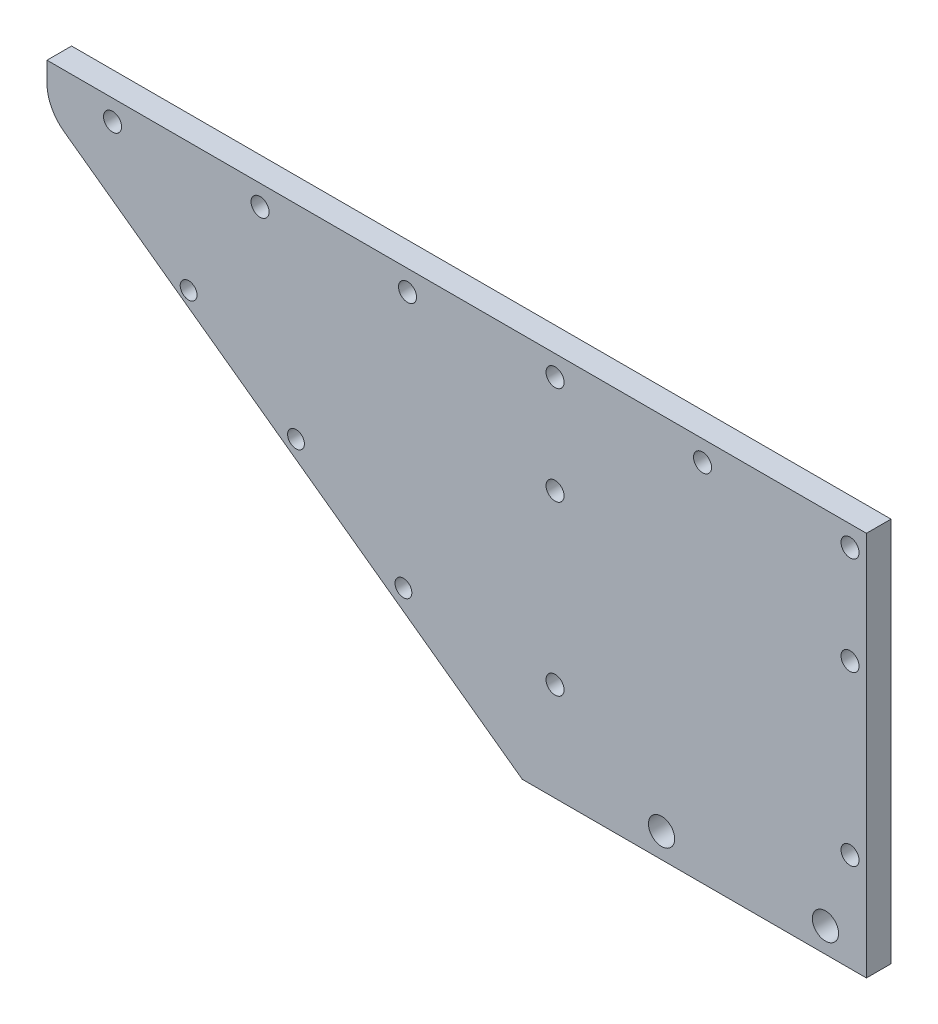
ISO-10303-21;
HEADER;
FILE_DESCRIPTION(('STEP AP214'),'2;1');
FILE_NAME('part.step','',(''),(''),'','','');
FILE_SCHEMA(('AUTOMOTIVE_DESIGN { 1 0 10303 214 1 1 1 1 }'));
ENDSEC;
DATA;
#1=APPLICATION_CONTEXT('core data for automotive mechanical design processes');
#2=APPLICATION_PROTOCOL_DEFINITION('international standard','automotive_design',2000,#1);
#3=PRODUCT_CONTEXT('',#1,'mechanical');
#4=PRODUCT('Part','Part','',(#3));
#5=PRODUCT_RELATED_PRODUCT_CATEGORY('part','',(#4));
#6=PRODUCT_DEFINITION_FORMATION('','',#4);
#7=PRODUCT_DEFINITION_CONTEXT('part definition',#1,'design');
#8=PRODUCT_DEFINITION('design','',#6,#7);
#9=PRODUCT_DEFINITION_SHAPE('','',#8);
#10=(LENGTH_UNIT() NAMED_UNIT(*) SI_UNIT(.MILLI.,.METRE.));
#11=(NAMED_UNIT(*) PLANE_ANGLE_UNIT() SI_UNIT($,.RADIAN.));
#12=(NAMED_UNIT(*) SI_UNIT($,.STERADIAN.) SOLID_ANGLE_UNIT());
#13=UNCERTAINTY_MEASURE_WITH_UNIT(LENGTH_MEASURE(1.E-05),#10,'distance_accuracy_value','');
#14=(GEOMETRIC_REPRESENTATION_CONTEXT(3) GLOBAL_UNCERTAINTY_ASSIGNED_CONTEXT((#13)) GLOBAL_UNIT_ASSIGNED_CONTEXT((#10,
#11,#12)) REPRESENTATION_CONTEXT('',''));
#15=CARTESIAN_POINT('',(0.,0.,0.));
#16=DIRECTION('',(0.,0.,1.));
#17=DIRECTION('',(1.,0.,0.));
#18=AXIS2_PLACEMENT_3D('',#15,#16,#17);
#19=CARTESIAN_POINT('',(-100.,0.,3.));
#20=DIRECTION('',(0.,-1.,0.));
#21=DIRECTION('',(0.,0.,-1.));
#22=AXIS2_PLACEMENT_3D('',#19,#20,#21);
#23=PLANE('',#22);
#24=DIRECTION('',(-1.,0.,0.));
#25=VECTOR('',#24,1.);
#26=CARTESIAN_POINT('',(-100.,0.,0.));
#27=LINE('',#26,#25);
#28=CARTESIAN_POINT('',(0.,0.,0.));
#29=VERTEX_POINT('',#28);
#30=CARTESIAN_POINT('',(-100.,0.,0.));
#31=VERTEX_POINT('',#30);
#32=EDGE_CURVE('E118',#29,#31,#27,.T.);
#33=ORIENTED_EDGE('',*,*,#32,.T.);
#34=DIRECTION('',(0.,0.,-1.));
#35=VECTOR('',#34,1.);
#36=CARTESIAN_POINT('',(-100.,0.,3.));
#37=LINE('',#36,#35);
#38=CARTESIAN_POINT('',(-100.,0.,3.));
#39=VERTEX_POINT('',#38);
#40=EDGE_CURVE('E99',#39,#31,#37,.T.);
#41=ORIENTED_EDGE('',*,*,#40,.F.);
#42=DIRECTION('',(-1.,0.,0.));
#43=VECTOR('',#42,1.);
#44=CARTESIAN_POINT('',(-100.,0.,3.));
#45=LINE('',#44,#43);
#46=CARTESIAN_POINT('',(0.,0.,3.));
#47=VERTEX_POINT('',#46);
#48=EDGE_CURVE('E105',#47,#39,#45,.T.);
#49=ORIENTED_EDGE('',*,*,#48,.F.);
#50=DIRECTION('',(0.,0.,-1.));
#51=VECTOR('',#50,1.);
#52=CARTESIAN_POINT('',(0.,0.,3.));
#53=LINE('',#52,#51);
#54=EDGE_CURVE('E137',#47,#29,#53,.T.);
#55=ORIENTED_EDGE('',*,*,#54,.T.);
#56=EDGE_LOOP('',(#33,#41,#49,#55));
#57=FACE_BOUND('',#56,.T.);
#58=ADVANCED_FACE('F45',(#57),#23,.F.);
#59=CARTESIAN_POINT('',(-100.,-5.,3.));
#60=DIRECTION('',(1.,0.,0.));
#61=DIRECTION('',(0.,0.,-1.));
#62=AXIS2_PLACEMENT_3D('',#59,#60,#61);
#63=PLANE('',#62);
#64=DIRECTION('',(0.,-1.,0.));
#65=VECTOR('',#64,1.);
#66=CARTESIAN_POINT('',(-100.,-5.,0.));
#67=LINE('',#66,#65);
#68=CARTESIAN_POINT('',(-100.,-2.44740903794201,0.));
#69=VERTEX_POINT('',#68);
#70=EDGE_CURVE('E148',#31,#69,#67,.T.);
#71=ORIENTED_EDGE('',*,*,#70,.T.);
#72=DIRECTION('',(0.,0.,-1.));
#73=VECTOR('',#72,1.);
#74=CARTESIAN_POINT('',(-100.,-2.44740903794201,3.));
#75=LINE('',#74,#73);
#76=CARTESIAN_POINT('',(-100.,-2.44740903794201,3.));
#77=VERTEX_POINT('',#76);
#78=EDGE_CURVE('E54',#69,#77,#75,.F.);
#79=ORIENTED_EDGE('',*,*,#78,.T.);
#80=DIRECTION('',(0.,-1.,0.));
#81=VECTOR('',#80,1.);
#82=CARTESIAN_POINT('',(-100.,-5.,3.));
#83=LINE('',#82,#81);
#84=EDGE_CURVE('E95',#39,#77,#83,.T.);
#85=ORIENTED_EDGE('',*,*,#84,.F.);
#86=ORIENTED_EDGE('',*,*,#40,.T.);
#87=EDGE_LOOP('',(#71,#79,#85,#86));
#88=FACE_BOUND('',#87,.T.);
#89=ADVANCED_FACE('F97',(#88),#63,.F.);
#90=CARTESIAN_POINT('',(-42.,-47.,3.));
#91=DIRECTION('',(0.586509812151843,0.809942121543021,0.));
#92=DIRECTION('',(-0.809942121543021,0.586509812151843,0.));
#93=AXIS2_PLACEMENT_3D('',#90,#91,#92);
#94=PLANE('',#93);
#95=DIRECTION('',(0.809942121543021,-0.586509812151843,0.));
#96=VECTOR('',#95,1.);
#97=CARTESIAN_POINT('',(-42.,-47.,3.));
#98=LINE('',#97,#96);
#99=CARTESIAN_POINT('',(-97.9325490607592,-6.49711964565711,3.));
#100=VERTEX_POINT('',#99);
#101=CARTESIAN_POINT('',(-42.,-47.,3.));
#102=VERTEX_POINT('',#101);
#103=EDGE_CURVE('E104',#100,#102,#98,.T.);
#104=ORIENTED_EDGE('',*,*,#103,.F.);
#105=DIRECTION('',(0.,0.,-1.));
#106=VECTOR('',#105,1.);
#107=CARTESIAN_POINT('',(-97.9325490607592,-6.49711964565711,3.));
#108=LINE('',#107,#106);
#109=CARTESIAN_POINT('',(-97.9325490607592,-6.49711964565711,0.));
#110=VERTEX_POINT('',#109);
#111=EDGE_CURVE('E120',#100,#110,#108,.T.);
#112=ORIENTED_EDGE('',*,*,#111,.T.);
#113=DIRECTION('',(0.809942121543021,-0.586509812151843,0.));
#114=VECTOR('',#113,1.);
#115=CARTESIAN_POINT('',(-42.,-47.,0.));
#116=LINE('',#115,#114);
#117=CARTESIAN_POINT('',(-42.,-47.,0.));
#118=VERTEX_POINT('',#117);
#119=EDGE_CURVE('E145',#110,#118,#116,.T.);
#120=ORIENTED_EDGE('',*,*,#119,.T.);
#121=DIRECTION('',(0.,0.,-1.));
#122=VECTOR('',#121,1.);
#123=CARTESIAN_POINT('',(-42.,-47.,3.));
#124=LINE('',#123,#122);
#125=EDGE_CURVE('E121',#102,#118,#124,.T.);
#126=ORIENTED_EDGE('',*,*,#125,.F.);
#127=EDGE_LOOP('',(#104,#112,#120,#126));
#128=FACE_BOUND('',#127,.T.);
#129=ADVANCED_FACE('F329',(#128),#94,.F.);
#130=CARTESIAN_POINT('',(0.,-47.,3.));
#131=DIRECTION('',(0.,1.,0.));
#132=DIRECTION('',(-1.,0.,0.));
#133=AXIS2_PLACEMENT_3D('',#130,#131,#132);
#134=PLANE('',#133);
#135=DIRECTION('',(1.,0.,0.));
#136=VECTOR('',#135,1.);
#137=CARTESIAN_POINT('',(0.,-47.,0.));
#138=LINE('',#137,#136);
#139=CARTESIAN_POINT('',(0.,-47.,0.));
#140=VERTEX_POINT('',#139);
#141=EDGE_CURVE('E142',#118,#140,#138,.T.);
#142=ORIENTED_EDGE('',*,*,#141,.T.);
#143=DIRECTION('',(0.,0.,-1.));
#144=VECTOR('',#143,1.);
#145=CARTESIAN_POINT('',(0.,-47.,3.));
#146=LINE('',#145,#144);
#147=CARTESIAN_POINT('',(0.,-47.,3.));
#148=VERTEX_POINT('',#147);
#149=EDGE_CURVE('E128',#148,#140,#146,.T.);
#150=ORIENTED_EDGE('',*,*,#149,.F.);
#151=DIRECTION('',(1.,0.,0.));
#152=VECTOR('',#151,1.);
#153=CARTESIAN_POINT('',(0.,-47.,3.));
#154=LINE('',#153,#152);
#155=EDGE_CURVE('E156',#102,#148,#154,.T.);
#156=ORIENTED_EDGE('',*,*,#155,.F.);
#157=ORIENTED_EDGE('',*,*,#125,.T.);
#158=EDGE_LOOP('',(#142,#150,#156,#157));
#159=FACE_BOUND('',#158,.T.);
#160=ADVANCED_FACE('F334',(#159),#134,.F.);
#161=CARTESIAN_POINT('',(0.,0.,3.));
#162=DIRECTION('',(-1.,0.,0.));
#163=DIRECTION('',(0.,-1.,0.));
#164=AXIS2_PLACEMENT_3D('',#161,#162,#163);
#165=PLANE('',#164);
#166=DIRECTION('',(0.,1.,0.));
#167=VECTOR('',#166,1.);
#168=CARTESIAN_POINT('',(0.,0.,0.));
#169=LINE('',#168,#167);
#170=EDGE_CURVE('E115',#140,#29,#169,.T.);
#171=ORIENTED_EDGE('',*,*,#170,.T.);
#172=ORIENTED_EDGE('',*,*,#54,.F.);
#173=DIRECTION('',(0.,1.,0.));
#174=VECTOR('',#173,1.);
#175=CARTESIAN_POINT('',(0.,0.,3.));
#176=LINE('',#175,#174);
#177=EDGE_CURVE('E110',#148,#47,#176,.T.);
#178=ORIENTED_EDGE('',*,*,#177,.F.);
#179=ORIENTED_EDGE('',*,*,#149,.T.);
#180=EDGE_LOOP('',(#171,#172,#178,#179));
#181=FACE_BOUND('',#180,.T.);
#182=ADVANCED_FACE('F294',(#181),#165,.F.);
#183=CARTESIAN_POINT('',(0.,0.,3.));
#184=DIRECTION('',(0.,0.,-1.));
#185=DIRECTION('',(-1.,0.,0.));
#186=AXIS2_PLACEMENT_3D('',#183,#184,#185);
#187=PLANE('',#186);
#188=CARTESIAN_POINT('',(-4.99999999999989,-44.,3.));
#189=DIRECTION('',(0.,0.,1.));
#190=DIRECTION('',(1.,0.,0.));
#191=AXIS2_PLACEMENT_3D('',#188,#189,#190);
#192=CIRCLE('',#191,1.6);
#193=CARTESIAN_POINT('',(-3.3999999999999,-44.,3.));
#194=VERTEX_POINT('',#193);
#195=EDGE_CURVE('E201',#194,#194,#192,.T.);
#196=ORIENTED_EDGE('',*,*,#195,.F.);
#197=EDGE_LOOP('',(#196));
#198=FACE_BOUND('',#197,.T.);
#199=CARTESIAN_POINT('',(-1.99999999999988,-35.,3.));
#200=DIRECTION('',(0.,0.,1.));
#201=DIRECTION('',(1.,0.,0.));
#202=AXIS2_PLACEMENT_3D('',#199,#200,#201);
#203=CIRCLE('',#202,1.1);
#204=CARTESIAN_POINT('',(-0.899999999999887,-35.,3.));
#205=VERTEX_POINT('',#204);
#206=EDGE_CURVE('E210',#205,#205,#203,.T.);
#207=ORIENTED_EDGE('',*,*,#206,.F.);
#208=EDGE_LOOP('',(#207));
#209=FACE_BOUND('',#208,.T.);
#210=CARTESIAN_POINT('',(-38.0000000000001,-14.5,3.));
#211=DIRECTION('',(0.,0.,1.));
#212=DIRECTION('',(-1.,0.,0.));
#213=AXIS2_PLACEMENT_3D('',#210,#211,#212);
#214=CIRCLE('',#213,1.10000000000001);
#215=CARTESIAN_POINT('',(-39.1000000000001,-14.5,3.));
#216=VERTEX_POINT('',#215);
#217=EDGE_CURVE('E218',#216,#216,#214,.T.);
#218=ORIENTED_EDGE('',*,*,#217,.F.);
#219=EDGE_LOOP('',(#218));
#220=FACE_BOUND('',#219,.T.);
#221=CARTESIAN_POINT('',(-1.99999999999988,-14.5,3.));
#222=DIRECTION('',(0.,0.,1.));
#223=DIRECTION('',(1.,0.,0.));
#224=AXIS2_PLACEMENT_3D('',#221,#222,#223);
#225=CIRCLE('',#224,1.1);
#226=CARTESIAN_POINT('',(-0.899999999999882,-14.5,3.));
#227=VERTEX_POINT('',#226);
#228=EDGE_CURVE('E226',#227,#227,#225,.T.);
#229=ORIENTED_EDGE('',*,*,#228,.F.);
#230=EDGE_LOOP('',(#229));
#231=FACE_BOUND('',#230,.T.);
#232=CARTESIAN_POINT('',(-74.0000000000001,-2.50000000000026,3.));
#233=DIRECTION('',(0.,0.,1.));
#234=DIRECTION('',(-1.,0.,0.));
#235=AXIS2_PLACEMENT_3D('',#232,#233,#234);
#236=CIRCLE('',#235,1.09999999999999);
#237=CARTESIAN_POINT('',(-75.1000000000001,-2.50000000000026,3.));
#238=VERTEX_POINT('',#237);
#239=EDGE_CURVE('E178',#238,#238,#236,.T.);
#240=ORIENTED_EDGE('',*,*,#239,.F.);
#241=EDGE_LOOP('',(#240));
#242=FACE_BOUND('',#241,.T.);
#243=CARTESIAN_POINT('',(-20.,-2.5,3.));
#244=DIRECTION('',(0.,0.,1.));
#245=DIRECTION('',(1.,0.,0.));
#246=AXIS2_PLACEMENT_3D('',#243,#244,#245);
#247=CIRCLE('',#246,1.1);
#248=CARTESIAN_POINT('',(-18.9,-2.5,3.));
#249=VERTEX_POINT('',#248);
#250=EDGE_CURVE('E169',#249,#249,#247,.T.);
#251=ORIENTED_EDGE('',*,*,#250,.F.);
#252=EDGE_LOOP('',(#251));
#253=FACE_BOUND('',#252,.T.);
#254=CARTESIAN_POINT('',(-38.0000000000001,-35.,3.));
#255=DIRECTION('',(0.,0.,1.));
#256=DIRECTION('',(-1.,0.,0.));
#257=AXIS2_PLACEMENT_3D('',#254,#255,#256);
#258=CIRCLE('',#257,1.10000000000001);
#259=CARTESIAN_POINT('',(-39.1000000000001,-35.,3.));
#260=VERTEX_POINT('',#259);
#261=EDGE_CURVE('E194',#260,#260,#258,.T.);
#262=ORIENTED_EDGE('',*,*,#261,.F.);
#263=EDGE_LOOP('',(#262));
#264=FACE_BOUND('',#263,.T.);
#265=CARTESIAN_POINT('',(-1.99999999999989,-2.5,3.));
#266=DIRECTION('',(0.,0.,1.));
#267=DIRECTION('',(1.,0.,0.));
#268=AXIS2_PLACEMENT_3D('',#265,#266,#267);
#269=CIRCLE('',#268,1.1);
#270=CARTESIAN_POINT('',(-0.899999999999891,-2.5,3.));
#271=VERTEX_POINT('',#270);
#272=EDGE_CURVE('E185',#271,#271,#269,.T.);
#273=ORIENTED_EDGE('',*,*,#272,.F.);
#274=EDGE_LOOP('',(#273));
#275=FACE_BOUND('',#274,.T.);
#276=CARTESIAN_POINT('',(-82.7172920390372,-15.6785381737922,3.));
#277=DIRECTION('',(0.,0.,1.));
#278=DIRECTION('',(1.,0.,0.));
#279=AXIS2_PLACEMENT_3D('',#276,#277,#278);
#280=CIRCLE('',#279,1.02501319241651);
#281=CARTESIAN_POINT('',(-81.6922788466207,-15.6785381737922,3.));
#282=VERTEX_POINT('',#281);
#283=EDGE_CURVE('E265',#282,#282,#280,.T.);
#284=ORIENTED_EDGE('',*,*,#283,.F.);
#285=EDGE_LOOP('',(#284));
#286=FACE_BOUND('',#285,.T.);
#287=CARTESIAN_POINT('',(-69.6095813107326,-24.8539356836054,3.));
#288=DIRECTION('',(0.,0.,1.));
#289=DIRECTION('',(1.,0.,0.));
#290=AXIS2_PLACEMENT_3D('',#287,#288,#289);
#291=CIRCLE('',#290,1.02501319241651);
#292=CARTESIAN_POINT('',(-68.5845681183161,-24.8539356836054,3.));
#293=VERTEX_POINT('',#292);
#294=EDGE_CURVE('E273',#293,#293,#291,.T.);
#295=ORIENTED_EDGE('',*,*,#294,.F.);
#296=EDGE_LOOP('',(#295));
#297=FACE_BOUND('',#296,.T.);
#298=CARTESIAN_POINT('',(-56.5018705824279,-34.0293331934187,3.));
#299=DIRECTION('',(0.,0.,1.));
#300=DIRECTION('',(1.,0.,0.));
#301=AXIS2_PLACEMENT_3D('',#298,#299,#300);
#302=CIRCLE('',#301,1.02501319241641);
#303=CARTESIAN_POINT('',(-55.4768573900115,-34.0293331934187,3.));
#304=VERTEX_POINT('',#303);
#305=EDGE_CURVE('E233',#304,#304,#302,.T.);
#306=ORIENTED_EDGE('',*,*,#305,.F.);
#307=EDGE_LOOP('',(#306));
#308=FACE_BOUND('',#307,.T.);
#309=CARTESIAN_POINT('',(-92.0000000000001,-2.50000000000038,3.));
#310=DIRECTION('',(0.,0.,1.));
#311=DIRECTION('',(-1.,0.,0.));
#312=AXIS2_PLACEMENT_3D('',#309,#310,#311);
#313=CIRCLE('',#312,1.10000000000001);
#314=CARTESIAN_POINT('',(-93.1000000000001,-2.50000000000038,3.));
#315=VERTEX_POINT('',#314);
#316=EDGE_CURVE('E242',#315,#315,#313,.T.);
#317=ORIENTED_EDGE('',*,*,#316,.F.);
#318=EDGE_LOOP('',(#317));
#319=FACE_BOUND('',#318,.T.);
#320=CARTESIAN_POINT('',(-24.9999999999999,-44.,3.));
#321=DIRECTION('',(0.,0.,1.));
#322=DIRECTION('',(1.,0.,0.));
#323=AXIS2_PLACEMENT_3D('',#320,#321,#322);
#324=CIRCLE('',#323,1.6);
#325=CARTESIAN_POINT('',(-23.3999999999999,-44.,3.));
#326=VERTEX_POINT('',#325);
#327=EDGE_CURVE('E250',#326,#326,#324,.T.);
#328=ORIENTED_EDGE('',*,*,#327,.F.);
#329=EDGE_LOOP('',(#328));
#330=FACE_BOUND('',#329,.T.);
#331=CARTESIAN_POINT('',(-38.0000000000001,-2.50000000000001,3.));
#332=DIRECTION('',(0.,0.,1.));
#333=DIRECTION('',(-1.,0.,0.));
#334=AXIS2_PLACEMENT_3D('',#331,#332,#333);
#335=CIRCLE('',#334,1.10000000000001);
#336=CARTESIAN_POINT('',(-39.1000000000001,-2.50000000000001,3.));
#337=VERTEX_POINT('',#336);
#338=EDGE_CURVE('E258',#337,#337,#335,.T.);
#339=ORIENTED_EDGE('',*,*,#338,.F.);
#340=EDGE_LOOP('',(#339));
#341=FACE_BOUND('',#340,.T.);
#342=CARTESIAN_POINT('',(-56.0000000000001,-2.50000000000013,3.));
#343=DIRECTION('',(0.,0.,1.));
#344=DIRECTION('',(-1.,0.,0.));
#345=AXIS2_PLACEMENT_3D('',#342,#343,#344);
#346=CIRCLE('',#345,1.10000000000001);
#347=CARTESIAN_POINT('',(-57.1000000000001,-2.50000000000013,3.));
#348=VERTEX_POINT('',#347);
#349=EDGE_CURVE('E161',#348,#348,#346,.T.);
#350=ORIENTED_EDGE('',*,*,#349,.F.);
#351=EDGE_LOOP('',(#350));
#352=FACE_BOUND('',#351,.T.);
#353=ORIENTED_EDGE('',*,*,#84,.T.);
#354=CARTESIAN_POINT('',(-95.,-2.44740903794201,3.));
#355=DIRECTION('',(0.,0.,-1.));
#356=DIRECTION('',(-1.,0.,0.));
#357=AXIS2_PLACEMENT_3D('',#354,#355,#356);
#358=CIRCLE('',#357,5.);
#359=EDGE_CURVE('E11',#77,#100,#358,.F.);
#360=ORIENTED_EDGE('',*,*,#359,.T.);
#361=ORIENTED_EDGE('',*,*,#103,.T.);
#362=ORIENTED_EDGE('',*,*,#155,.T.);
#363=ORIENTED_EDGE('',*,*,#177,.T.);
#364=ORIENTED_EDGE('',*,*,#48,.T.);
#365=EDGE_LOOP('',(#353,#360,#361,#362,#363,#364));
#366=FACE_BOUND('',#365,.T.);
#367=ADVANCED_FACE('F108',(#198,#209,#220,#231,#242,#253,#264,#275,#286,#297,#308,#319,#330,
#341,#352,#366),#187,.F.);
#368=CARTESIAN_POINT('',(0.,0.,0.));
#369=DIRECTION('',(0.,0.,-1.));
#370=DIRECTION('',(-1.,0.,0.));
#371=AXIS2_PLACEMENT_3D('',#368,#369,#370);
#372=PLANE('',#371);
#373=CARTESIAN_POINT('',(-4.99999999999989,-44.,0.));
#374=DIRECTION('',(0.,0.,1.));
#375=DIRECTION('',(1.,0.,0.));
#376=AXIS2_PLACEMENT_3D('',#373,#374,#375);
#377=CIRCLE('',#376,1.6);
#378=CARTESIAN_POINT('',(-3.3999999999999,-44.,0.));
#379=VERTEX_POINT('',#378);
#380=EDGE_CURVE('E205',#379,#379,#377,.T.);
#381=ORIENTED_EDGE('',*,*,#380,.T.);
#382=EDGE_LOOP('',(#381));
#383=FACE_BOUND('',#382,.T.);
#384=CARTESIAN_POINT('',(-1.99999999999988,-35.,0.));
#385=DIRECTION('',(0.,0.,1.));
#386=DIRECTION('',(1.,0.,0.));
#387=AXIS2_PLACEMENT_3D('',#384,#385,#386);
#388=CIRCLE('',#387,1.1);
#389=CARTESIAN_POINT('',(-0.899999999999887,-35.,0.));
#390=VERTEX_POINT('',#389);
#391=EDGE_CURVE('E214',#390,#390,#388,.T.);
#392=ORIENTED_EDGE('',*,*,#391,.T.);
#393=EDGE_LOOP('',(#392));
#394=FACE_BOUND('',#393,.T.);
#395=CARTESIAN_POINT('',(-38.0000000000001,-14.5,0.));
#396=DIRECTION('',(0.,0.,1.));
#397=DIRECTION('',(-1.,0.,0.));
#398=AXIS2_PLACEMENT_3D('',#395,#396,#397);
#399=CIRCLE('',#398,1.10000000000001);
#400=CARTESIAN_POINT('',(-39.1000000000001,-14.5,0.));
#401=VERTEX_POINT('',#400);
#402=EDGE_CURVE('E222',#401,#401,#399,.T.);
#403=ORIENTED_EDGE('',*,*,#402,.T.);
#404=EDGE_LOOP('',(#403));
#405=FACE_BOUND('',#404,.T.);
#406=CARTESIAN_POINT('',(-1.99999999999988,-14.5,0.));
#407=DIRECTION('',(0.,0.,1.));
#408=DIRECTION('',(1.,0.,0.));
#409=AXIS2_PLACEMENT_3D('',#406,#407,#408);
#410=CIRCLE('',#409,1.1);
#411=CARTESIAN_POINT('',(-0.899999999999882,-14.5,0.));
#412=VERTEX_POINT('',#411);
#413=EDGE_CURVE('E190',#412,#412,#410,.T.);
#414=ORIENTED_EDGE('',*,*,#413,.T.);
#415=EDGE_LOOP('',(#414));
#416=FACE_BOUND('',#415,.T.);
#417=CARTESIAN_POINT('',(-74.0000000000001,-2.50000000000026,0.));
#418=DIRECTION('',(0.,0.,1.));
#419=DIRECTION('',(-1.,0.,0.));
#420=AXIS2_PLACEMENT_3D('',#417,#418,#419);
#421=CIRCLE('',#420,1.09999999999999);
#422=CARTESIAN_POINT('',(-75.1000000000001,-2.50000000000026,0.));
#423=VERTEX_POINT('',#422);
#424=EDGE_CURVE('E165',#423,#423,#421,.T.);
#425=ORIENTED_EDGE('',*,*,#424,.T.);
#426=EDGE_LOOP('',(#425));
#427=FACE_BOUND('',#426,.T.);
#428=CARTESIAN_POINT('',(-20.,-2.5,0.));
#429=DIRECTION('',(0.,0.,1.));
#430=DIRECTION('',(1.,0.,0.));
#431=AXIS2_PLACEMENT_3D('',#428,#429,#430);
#432=CIRCLE('',#431,1.1);
#433=CARTESIAN_POINT('',(-18.9,-2.5,0.));
#434=VERTEX_POINT('',#433);
#435=EDGE_CURVE('E173',#434,#434,#432,.T.);
#436=ORIENTED_EDGE('',*,*,#435,.T.);
#437=EDGE_LOOP('',(#436));
#438=FACE_BOUND('',#437,.T.);
#439=CARTESIAN_POINT('',(-38.0000000000001,-35.,0.));
#440=DIRECTION('',(0.,0.,1.));
#441=DIRECTION('',(-1.,0.,0.));
#442=AXIS2_PLACEMENT_3D('',#439,#440,#441);
#443=CIRCLE('',#442,1.10000000000001);
#444=CARTESIAN_POINT('',(-39.1000000000001,-35.,0.));
#445=VERTEX_POINT('',#444);
#446=EDGE_CURVE('E174',#445,#445,#443,.T.);
#447=ORIENTED_EDGE('',*,*,#446,.T.);
#448=EDGE_LOOP('',(#447));
#449=FACE_BOUND('',#448,.T.);
#450=CARTESIAN_POINT('',(-1.99999999999989,-2.5,0.));
#451=DIRECTION('',(0.,0.,1.));
#452=DIRECTION('',(1.,0.,0.));
#453=AXIS2_PLACEMENT_3D('',#450,#451,#452);
#454=CIRCLE('',#453,1.1);
#455=CARTESIAN_POINT('',(-0.899999999999891,-2.5,0.));
#456=VERTEX_POINT('',#455);
#457=EDGE_CURVE('E189',#456,#456,#454,.T.);
#458=ORIENTED_EDGE('',*,*,#457,.T.);
#459=EDGE_LOOP('',(#458));
#460=FACE_BOUND('',#459,.T.);
#461=CARTESIAN_POINT('',(-82.7172920390372,-15.6785381737922,0.));
#462=DIRECTION('',(0.,0.,1.));
#463=DIRECTION('',(1.,0.,0.));
#464=AXIS2_PLACEMENT_3D('',#461,#462,#463);
#465=CIRCLE('',#464,1.02501319241651);
#466=CARTESIAN_POINT('',(-81.6922788466207,-15.6785381737922,0.));
#467=VERTEX_POINT('',#466);
#468=EDGE_CURVE('E269',#467,#467,#465,.T.);
#469=ORIENTED_EDGE('',*,*,#468,.T.);
#470=EDGE_LOOP('',(#469));
#471=FACE_BOUND('',#470,.T.);
#472=CARTESIAN_POINT('',(-69.6095813107326,-24.8539356836054,0.));
#473=DIRECTION('',(0.,0.,1.));
#474=DIRECTION('',(1.,0.,0.));
#475=AXIS2_PLACEMENT_3D('',#472,#473,#474);
#476=CIRCLE('',#475,1.02501319241651);
#477=CARTESIAN_POINT('',(-68.5845681183161,-24.8539356836054,0.));
#478=VERTEX_POINT('',#477);
#479=EDGE_CURVE('E238',#478,#478,#476,.T.);
#480=ORIENTED_EDGE('',*,*,#479,.T.);
#481=EDGE_LOOP('',(#480));
#482=FACE_BOUND('',#481,.T.);
#483=CARTESIAN_POINT('',(-56.5018705824279,-34.0293331934187,0.));
#484=DIRECTION('',(0.,0.,1.));
#485=DIRECTION('',(1.,0.,0.));
#486=AXIS2_PLACEMENT_3D('',#483,#484,#485);
#487=CIRCLE('',#486,1.02501319241641);
#488=CARTESIAN_POINT('',(-55.4768573900115,-34.0293331934187,0.));
#489=VERTEX_POINT('',#488);
#490=EDGE_CURVE('E237',#489,#489,#487,.T.);
#491=ORIENTED_EDGE('',*,*,#490,.T.);
#492=EDGE_LOOP('',(#491));
#493=FACE_BOUND('',#492,.T.);
#494=CARTESIAN_POINT('',(-92.0000000000001,-2.50000000000038,0.));
#495=DIRECTION('',(0.,0.,1.));
#496=DIRECTION('',(-1.,0.,0.));
#497=AXIS2_PLACEMENT_3D('',#494,#495,#496);
#498=CIRCLE('',#497,1.10000000000001);
#499=CARTESIAN_POINT('',(-93.1000000000001,-2.50000000000038,0.));
#500=VERTEX_POINT('',#499);
#501=EDGE_CURVE('E246',#500,#500,#498,.T.);
#502=ORIENTED_EDGE('',*,*,#501,.T.);
#503=EDGE_LOOP('',(#502));
#504=FACE_BOUND('',#503,.T.);
#505=CARTESIAN_POINT('',(-24.9999999999999,-44.,0.));
#506=DIRECTION('',(0.,0.,1.));
#507=DIRECTION('',(1.,0.,0.));
#508=AXIS2_PLACEMENT_3D('',#505,#506,#507);
#509=CIRCLE('',#508,1.6);
#510=CARTESIAN_POINT('',(-23.3999999999999,-44.,0.));
#511=VERTEX_POINT('',#510);
#512=EDGE_CURVE('E254',#511,#511,#509,.T.);
#513=ORIENTED_EDGE('',*,*,#512,.T.);
#514=EDGE_LOOP('',(#513));
#515=FACE_BOUND('',#514,.T.);
#516=CARTESIAN_POINT('',(-38.0000000000001,-2.50000000000001,0.));
#517=DIRECTION('',(0.,0.,1.));
#518=DIRECTION('',(-1.,0.,0.));
#519=AXIS2_PLACEMENT_3D('',#516,#517,#518);
#520=CIRCLE('',#519,1.10000000000001);
#521=CARTESIAN_POINT('',(-39.1000000000001,-2.50000000000001,0.));
#522=VERTEX_POINT('',#521);
#523=EDGE_CURVE('E206',#522,#522,#520,.T.);
#524=ORIENTED_EDGE('',*,*,#523,.T.);
#525=EDGE_LOOP('',(#524));
#526=FACE_BOUND('',#525,.T.);
#527=CARTESIAN_POINT('',(-56.0000000000001,-2.50000000000013,0.));
#528=DIRECTION('',(0.,0.,1.));
#529=DIRECTION('',(-1.,0.,0.));
#530=AXIS2_PLACEMENT_3D('',#527,#528,#529);
#531=CIRCLE('',#530,1.10000000000001);
#532=CARTESIAN_POINT('',(-57.1000000000001,-2.50000000000013,0.));
#533=VERTEX_POINT('',#532);
#534=EDGE_CURVE('E153',#533,#533,#531,.T.);
#535=ORIENTED_EDGE('',*,*,#534,.T.);
#536=EDGE_LOOP('',(#535));
#537=FACE_BOUND('',#536,.T.);
#538=ORIENTED_EDGE('',*,*,#119,.F.);
#539=CARTESIAN_POINT('',(-95.,-2.44740903794201,0.));
#540=DIRECTION('',(0.,0.,-1.));
#541=DIRECTION('',(-1.,0.,0.));
#542=AXIS2_PLACEMENT_3D('',#539,#540,#541);
#543=CIRCLE('',#542,5.);
#544=EDGE_CURVE('E68',#110,#69,#543,.T.);
#545=ORIENTED_EDGE('',*,*,#544,.T.);
#546=ORIENTED_EDGE('',*,*,#70,.F.);
#547=ORIENTED_EDGE('',*,*,#32,.F.);
#548=ORIENTED_EDGE('',*,*,#170,.F.);
#549=ORIENTED_EDGE('',*,*,#141,.F.);
#550=EDGE_LOOP('',(#538,#545,#546,#547,#548,#549));
#551=FACE_BOUND('',#550,.T.);
#552=ADVANCED_FACE('F281',(#383,#394,#405,#416,#427,#438,#449,#460,#471,#482,#493,#504,#515,
#526,#537,#551),#372,.T.);
#553=CARTESIAN_POINT('',(-56.0000000000001,-2.50000000000013,0.));
#554=DIRECTION('',(0.,0.,1.));
#555=DIRECTION('',(1.,0.,0.));
#556=AXIS2_PLACEMENT_3D('',#553,#554,#555);
#557=CYLINDRICAL_SURFACE('',#556,1.10000000000001);
#558=ORIENTED_EDGE('',*,*,#534,.F.);
#559=EDGE_LOOP('',(#558));
#560=FACE_BOUND('',#559,.T.);
#561=ORIENTED_EDGE('',*,*,#349,.T.);
#562=EDGE_LOOP('',(#561));
#563=FACE_BOUND('',#562,.T.);
#564=ADVANCED_FACE('F307',(#560,#563),#557,.F.);
#565=CARTESIAN_POINT('',(-38.0000000000001,-2.50000000000001,0.));
#566=DIRECTION('',(0.,0.,1.));
#567=DIRECTION('',(1.,0.,0.));
#568=AXIS2_PLACEMENT_3D('',#565,#566,#567);
#569=CYLINDRICAL_SURFACE('',#568,1.10000000000001);
#570=ORIENTED_EDGE('',*,*,#523,.F.);
#571=EDGE_LOOP('',(#570));
#572=FACE_BOUND('',#571,.T.);
#573=ORIENTED_EDGE('',*,*,#338,.T.);
#574=EDGE_LOOP('',(#573));
#575=FACE_BOUND('',#574,.T.);
#576=ADVANCED_FACE('F309',(#572,#575),#569,.F.);
#577=CARTESIAN_POINT('',(-24.9999999999999,-44.,0.));
#578=DIRECTION('',(0.,0.,1.));
#579=DIRECTION('',(1.,0.,0.));
#580=AXIS2_PLACEMENT_3D('',#577,#578,#579);
#581=CYLINDRICAL_SURFACE('',#580,1.6);
#582=ORIENTED_EDGE('',*,*,#512,.F.);
#583=EDGE_LOOP('',(#582));
#584=FACE_BOUND('',#583,.T.);
#585=ORIENTED_EDGE('',*,*,#327,.T.);
#586=EDGE_LOOP('',(#585));
#587=FACE_BOUND('',#586,.T.);
#588=ADVANCED_FACE('F316',(#584,#587),#581,.F.);
#589=CARTESIAN_POINT('',(-92.0000000000001,-2.50000000000038,0.));
#590=DIRECTION('',(0.,0.,1.));
#591=DIRECTION('',(1.,0.,0.));
#592=AXIS2_PLACEMENT_3D('',#589,#590,#591);
#593=CYLINDRICAL_SURFACE('',#592,1.10000000000001);
#594=ORIENTED_EDGE('',*,*,#501,.F.);
#595=EDGE_LOOP('',(#594));
#596=FACE_BOUND('',#595,.T.);
#597=ORIENTED_EDGE('',*,*,#316,.T.);
#598=EDGE_LOOP('',(#597));
#599=FACE_BOUND('',#598,.T.);
#600=ADVANCED_FACE('F404',(#596,#599),#593,.F.);
#601=CARTESIAN_POINT('',(-56.5018705824279,-34.0293331934187,0.));
#602=DIRECTION('',(0.,0.,1.));
#603=DIRECTION('',(1.,0.,0.));
#604=AXIS2_PLACEMENT_3D('',#601,#602,#603);
#605=CYLINDRICAL_SURFACE('',#604,1.02501319241641);
#606=ORIENTED_EDGE('',*,*,#490,.F.);
#607=EDGE_LOOP('',(#606));
#608=FACE_BOUND('',#607,.T.);
#609=ORIENTED_EDGE('',*,*,#305,.T.);
#610=EDGE_LOOP('',(#609));
#611=FACE_BOUND('',#610,.T.);
#612=ADVANCED_FACE('F288',(#608,#611),#605,.F.);
#613=CARTESIAN_POINT('',(-69.6095813107326,-24.8539356836054,0.));
#614=DIRECTION('',(0.,0.,1.));
#615=DIRECTION('',(1.,0.,0.));
#616=AXIS2_PLACEMENT_3D('',#613,#614,#615);
#617=CYLINDRICAL_SURFACE('',#616,1.02501319241651);
#618=ORIENTED_EDGE('',*,*,#479,.F.);
#619=EDGE_LOOP('',(#618));
#620=FACE_BOUND('',#619,.T.);
#621=ORIENTED_EDGE('',*,*,#294,.T.);
#622=EDGE_LOOP('',(#621));
#623=FACE_BOUND('',#622,.T.);
#624=ADVANCED_FACE('F284',(#620,#623),#617,.F.);
#625=CARTESIAN_POINT('',(-82.7172920390372,-15.6785381737922,0.));
#626=DIRECTION('',(0.,0.,1.));
#627=DIRECTION('',(1.,0.,0.));
#628=AXIS2_PLACEMENT_3D('',#625,#626,#627);
#629=CYLINDRICAL_SURFACE('',#628,1.02501319241651);
#630=ORIENTED_EDGE('',*,*,#468,.F.);
#631=EDGE_LOOP('',(#630));
#632=FACE_BOUND('',#631,.T.);
#633=ORIENTED_EDGE('',*,*,#283,.T.);
#634=EDGE_LOOP('',(#633));
#635=FACE_BOUND('',#634,.T.);
#636=ADVANCED_FACE('F287',(#632,#635),#629,.F.);
#637=CARTESIAN_POINT('',(-1.99999999999989,-2.5,0.));
#638=DIRECTION('',(0.,0.,1.));
#639=DIRECTION('',(1.,0.,0.));
#640=AXIS2_PLACEMENT_3D('',#637,#638,#639);
#641=CYLINDRICAL_SURFACE('',#640,1.1);
#642=ORIENTED_EDGE('',*,*,#457,.F.);
#643=EDGE_LOOP('',(#642));
#644=FACE_BOUND('',#643,.T.);
#645=ORIENTED_EDGE('',*,*,#272,.T.);
#646=EDGE_LOOP('',(#645));
#647=FACE_BOUND('',#646,.T.);
#648=ADVANCED_FACE('F371',(#644,#647),#641,.F.);
#649=CARTESIAN_POINT('',(-38.0000000000001,-35.,0.));
#650=DIRECTION('',(0.,0.,1.));
#651=DIRECTION('',(1.,0.,0.));
#652=AXIS2_PLACEMENT_3D('',#649,#650,#651);
#653=CYLINDRICAL_SURFACE('',#652,1.10000000000001);
#654=ORIENTED_EDGE('',*,*,#446,.F.);
#655=EDGE_LOOP('',(#654));
#656=FACE_BOUND('',#655,.T.);
#657=ORIENTED_EDGE('',*,*,#261,.T.);
#658=EDGE_LOOP('',(#657));
#659=FACE_BOUND('',#658,.T.);
#660=ADVANCED_FACE('F367',(#656,#659),#653,.F.);
#661=CARTESIAN_POINT('',(-20.,-2.5,0.));
#662=DIRECTION('',(0.,0.,1.));
#663=DIRECTION('',(1.,0.,0.));
#664=AXIS2_PLACEMENT_3D('',#661,#662,#663);
#665=CYLINDRICAL_SURFACE('',#664,1.1);
#666=ORIENTED_EDGE('',*,*,#435,.F.);
#667=EDGE_LOOP('',(#666));
#668=FACE_BOUND('',#667,.T.);
#669=ORIENTED_EDGE('',*,*,#250,.T.);
#670=EDGE_LOOP('',(#669));
#671=FACE_BOUND('',#670,.T.);
#672=ADVANCED_FACE('F370',(#668,#671),#665,.F.);
#673=CARTESIAN_POINT('',(-74.0000000000001,-2.50000000000026,0.));
#674=DIRECTION('',(0.,0.,1.));
#675=DIRECTION('',(1.,0.,0.));
#676=AXIS2_PLACEMENT_3D('',#673,#674,#675);
#677=CYLINDRICAL_SURFACE('',#676,1.09999999999999);
#678=ORIENTED_EDGE('',*,*,#424,.F.);
#679=EDGE_LOOP('',(#678));
#680=FACE_BOUND('',#679,.T.);
#681=ORIENTED_EDGE('',*,*,#239,.T.);
#682=EDGE_LOOP('',(#681));
#683=FACE_BOUND('',#682,.T.);
#684=ADVANCED_FACE('F376',(#680,#683),#677,.F.);
#685=CARTESIAN_POINT('',(-1.99999999999988,-14.5,0.));
#686=DIRECTION('',(0.,0.,1.));
#687=DIRECTION('',(1.,0.,0.));
#688=AXIS2_PLACEMENT_3D('',#685,#686,#687);
#689=CYLINDRICAL_SURFACE('',#688,1.1);
#690=ORIENTED_EDGE('',*,*,#413,.F.);
#691=EDGE_LOOP('',(#690));
#692=FACE_BOUND('',#691,.T.);
#693=ORIENTED_EDGE('',*,*,#228,.T.);
#694=EDGE_LOOP('',(#693));
#695=FACE_BOUND('',#694,.T.);
#696=ADVANCED_FACE('F378',(#692,#695),#689,.F.);
#697=CARTESIAN_POINT('',(-38.0000000000001,-14.5,0.));
#698=DIRECTION('',(0.,0.,1.));
#699=DIRECTION('',(1.,0.,0.));
#700=AXIS2_PLACEMENT_3D('',#697,#698,#699);
#701=CYLINDRICAL_SURFACE('',#700,1.10000000000001);
#702=ORIENTED_EDGE('',*,*,#402,.F.);
#703=EDGE_LOOP('',(#702));
#704=FACE_BOUND('',#703,.T.);
#705=ORIENTED_EDGE('',*,*,#217,.T.);
#706=EDGE_LOOP('',(#705));
#707=FACE_BOUND('',#706,.T.);
#708=ADVANCED_FACE('F360',(#704,#707),#701,.F.);
#709=CARTESIAN_POINT('',(-1.99999999999988,-35.,0.));
#710=DIRECTION('',(0.,0.,1.));
#711=DIRECTION('',(1.,0.,0.));
#712=AXIS2_PLACEMENT_3D('',#709,#710,#711);
#713=CYLINDRICAL_SURFACE('',#712,1.1);
#714=ORIENTED_EDGE('',*,*,#391,.F.);
#715=EDGE_LOOP('',(#714));
#716=FACE_BOUND('',#715,.T.);
#717=ORIENTED_EDGE('',*,*,#206,.T.);
#718=EDGE_LOOP('',(#717));
#719=FACE_BOUND('',#718,.T.);
#720=ADVANCED_FACE('F354',(#716,#719),#713,.F.);
#721=CARTESIAN_POINT('',(-4.99999999999989,-44.,0.));
#722=DIRECTION('',(0.,0.,1.));
#723=DIRECTION('',(1.,0.,0.));
#724=AXIS2_PLACEMENT_3D('',#721,#722,#723);
#725=CYLINDRICAL_SURFACE('',#724,1.6);
#726=ORIENTED_EDGE('',*,*,#380,.F.);
#727=EDGE_LOOP('',(#726));
#728=FACE_BOUND('',#727,.T.);
#729=ORIENTED_EDGE('',*,*,#195,.T.);
#730=EDGE_LOOP('',(#729));
#731=FACE_BOUND('',#730,.T.);
#732=ADVANCED_FACE('F350',(#728,#731),#725,.F.);
#733=CARTESIAN_POINT('',(-95.,-2.44740903794201,3.));
#734=DIRECTION('',(0.,0.,-1.));
#735=DIRECTION('',(-1.,0.,0.));
#736=AXIS2_PLACEMENT_3D('',#733,#734,#735);
#737=CYLINDRICAL_SURFACE('',#736,5.);
#738=ORIENTED_EDGE('',*,*,#359,.F.);
#739=ORIENTED_EDGE('',*,*,#78,.F.);
#740=ORIENTED_EDGE('',*,*,#544,.F.);
#741=ORIENTED_EDGE('',*,*,#111,.F.);
#742=EDGE_LOOP('',(#738,#739,#740,#741));
#743=FACE_BOUND('',#742,.T.);
#744=ADVANCED_FACE('F47',(#743),#737,.T.);
#745=CLOSED_SHELL('',(#58,#89,#129,#160,#182,#367,#552,#564,#576,#588,#600,#612,#624,#636,#648,
#660,#672,#684,#696,#708,#720,#732,#744));
#746=MANIFOLD_SOLID_BREP('B2',#745);
#747=ADVANCED_BREP_SHAPE_REPRESENTATION('',(#18,#746),#14);
#748=SHAPE_DEFINITION_REPRESENTATION(#9,#747);
ENDSEC;
END-ISO-10303-21;
